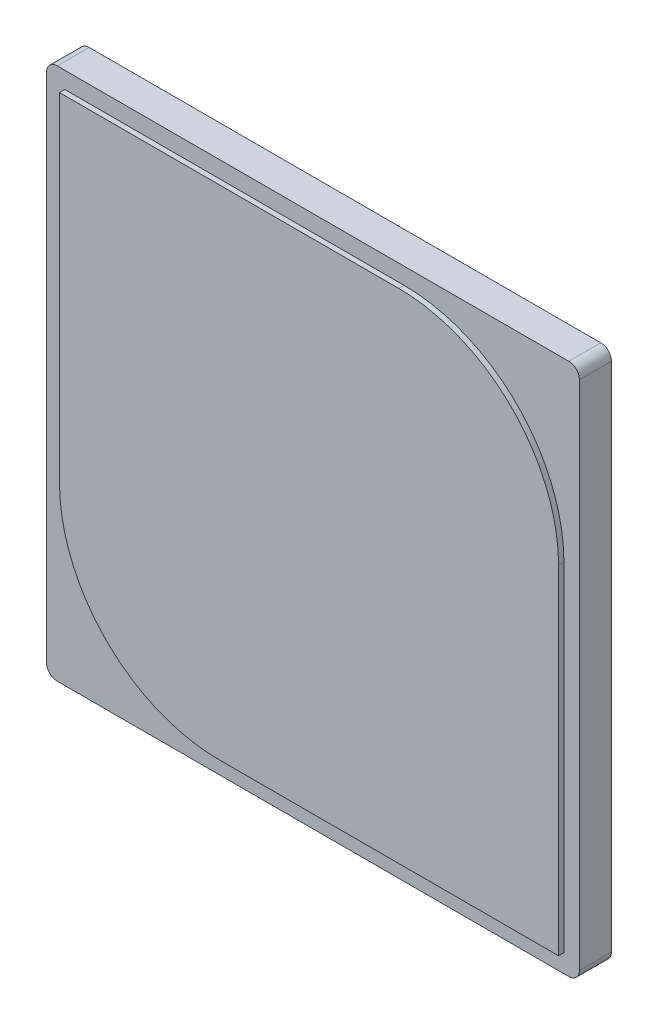
ISO-10303-21;
HEADER;
FILE_DESCRIPTION(('STEP AP214'),'2;1');
FILE_NAME('part.step','',(''),(''),'','','');
FILE_SCHEMA(('AUTOMOTIVE_DESIGN { 1 0 10303 214 1 1 1 1 }'));
ENDSEC;
DATA;
#1=APPLICATION_CONTEXT('core data for automotive mechanical design processes');
#2=APPLICATION_PROTOCOL_DEFINITION('international standard','automotive_design',2000,#1);
#3=PRODUCT_CONTEXT('',#1,'mechanical');
#4=PRODUCT('Part','Part','',(#3));
#5=PRODUCT_RELATED_PRODUCT_CATEGORY('part','',(#4));
#6=PRODUCT_DEFINITION_FORMATION('','',#4);
#7=PRODUCT_DEFINITION_CONTEXT('part definition',#1,'design');
#8=PRODUCT_DEFINITION('design','',#6,#7);
#9=PRODUCT_DEFINITION_SHAPE('','',#8);
#10=(LENGTH_UNIT() NAMED_UNIT(*) SI_UNIT(.MILLI.,.METRE.));
#11=(NAMED_UNIT(*) PLANE_ANGLE_UNIT() SI_UNIT($,.RADIAN.));
#12=(NAMED_UNIT(*) SI_UNIT($,.STERADIAN.) SOLID_ANGLE_UNIT());
#13=UNCERTAINTY_MEASURE_WITH_UNIT(LENGTH_MEASURE(1.E-05),#10,'distance_accuracy_value','');
#14=(GEOMETRIC_REPRESENTATION_CONTEXT(3) GLOBAL_UNCERTAINTY_ASSIGNED_CONTEXT((#13)) GLOBAL_UNIT_ASSIGNED_CONTEXT((#10,
#11,#12)) REPRESENTATION_CONTEXT('',''));
#15=CARTESIAN_POINT('',(0.,0.,0.));
#16=DIRECTION('',(0.,0.,1.));
#17=DIRECTION('',(1.,0.,0.));
#18=AXIS2_PLACEMENT_3D('',#15,#16,#17);
#19=CARTESIAN_POINT('',(-15.7317073170732,17.7317073170732,0.7));
#20=DIRECTION('',(1.,0.,0.));
#21=DIRECTION('',(0.,0.,-1.));
#22=AXIS2_PLACEMENT_3D('',#19,#20,#21);
#23=PLANE('',#22);
#24=DIRECTION('',(0.,-1.,0.));
#25=VECTOR('',#24,1.);
#26=CARTESIAN_POINT('',(-15.7317073170732,17.7317073170732,0.));
#27=LINE('',#26,#25);
#28=CARTESIAN_POINT('',(-15.7317073170732,17.5317073170732,0.));
#29=VERTEX_POINT('',#28);
#30=CARTESIAN_POINT('',(-15.7317073170732,7.93170731707317,0.));
#31=VERTEX_POINT('',#30);
#32=EDGE_CURVE('E208',#29,#31,#27,.T.);
#33=ORIENTED_EDGE('',*,*,#32,.T.);
#34=DIRECTION('',(0.,0.,-1.));
#35=VECTOR('',#34,1.);
#36=CARTESIAN_POINT('',(-15.7317073170732,7.93170731707317,0.7));
#37=LINE('',#36,#35);
#38=CARTESIAN_POINT('',(-15.7317073170732,7.93170731707317,0.6));
#39=VERTEX_POINT('',#38);
#40=EDGE_CURVE('E235',#31,#39,#37,.F.);
#41=ORIENTED_EDGE('',*,*,#40,.T.);
#42=DIRECTION('',(0.,-1.,0.));
#43=VECTOR('',#42,1.);
#44=CARTESIAN_POINT('',(-15.7317073170732,17.7317073170732,0.6));
#45=LINE('',#44,#43);
#46=CARTESIAN_POINT('',(-15.7317073170732,17.5317073170732,0.6));
#47=VERTEX_POINT('',#46);
#48=EDGE_CURVE('E191',#47,#39,#45,.T.);
#49=ORIENTED_EDGE('',*,*,#48,.F.);
#50=DIRECTION('',(0.,0.,-1.));
#51=VECTOR('',#50,1.);
#52=CARTESIAN_POINT('',(-15.7317073170732,17.5317073170732,0.7));
#53=LINE('',#52,#51);
#54=EDGE_CURVE('E232',#47,#29,#53,.T.);
#55=ORIENTED_EDGE('',*,*,#54,.T.);
#56=EDGE_LOOP('',(#33,#41,#49,#55));
#57=FACE_BOUND('',#56,.T.);
#58=ADVANCED_FACE('F36',(#57),#23,.F.);
#59=CARTESIAN_POINT('',(-15.7317073170732,7.73170731707317,0.7));
#60=DIRECTION('',(0.,1.,0.));
#61=DIRECTION('',(0.,0.,1.));
#62=AXIS2_PLACEMENT_3D('',#59,#60,#61);
#63=PLANE('',#62);
#64=DIRECTION('',(1.,0.,0.));
#65=VECTOR('',#64,1.);
#66=CARTESIAN_POINT('',(-15.7317073170732,7.73170731707317,0.6));
#67=LINE('',#66,#65);
#68=CARTESIAN_POINT('',(-15.5317073170732,7.73170731707317,0.6));
#69=VERTEX_POINT('',#68);
#70=CARTESIAN_POINT('',(-5.93170731707316,7.73170731707317,0.6));
#71=VERTEX_POINT('',#70);
#72=EDGE_CURVE('E201',#69,#71,#67,.T.);
#73=ORIENTED_EDGE('',*,*,#72,.F.);
#74=DIRECTION('',(0.,0.,-1.));
#75=VECTOR('',#74,1.);
#76=CARTESIAN_POINT('',(-15.5317073170732,7.73170731707317,0.7));
#77=LINE('',#76,#75);
#78=CARTESIAN_POINT('',(-15.5317073170732,7.73170731707317,0.));
#79=VERTEX_POINT('',#78);
#80=EDGE_CURVE('E221',#69,#79,#77,.T.);
#81=ORIENTED_EDGE('',*,*,#80,.T.);
#82=DIRECTION('',(1.,0.,0.));
#83=VECTOR('',#82,1.);
#84=CARTESIAN_POINT('',(-15.7317073170732,7.73170731707317,0.));
#85=LINE('',#84,#83);
#86=CARTESIAN_POINT('',(-5.93170731707316,7.73170731707317,0.));
#87=VERTEX_POINT('',#86);
#88=EDGE_CURVE('E211',#79,#87,#85,.T.);
#89=ORIENTED_EDGE('',*,*,#88,.T.);
#90=DIRECTION('',(0.,0.,-1.));
#91=VECTOR('',#90,1.);
#92=CARTESIAN_POINT('',(-5.93170731707316,7.73170731707317,0.7));
#93=LINE('',#92,#91);
#94=EDGE_CURVE('E219',#87,#71,#93,.F.);
#95=ORIENTED_EDGE('',*,*,#94,.T.);
#96=EDGE_LOOP('',(#73,#81,#89,#95));
#97=FACE_BOUND('',#96,.T.);
#98=ADVANCED_FACE('F277',(#97),#63,.F.);
#99=CARTESIAN_POINT('',(-5.73170731707317,17.7317073170732,0.7));
#100=DIRECTION('',(-1.,0.,0.));
#101=DIRECTION('',(0.,-1.,0.));
#102=AXIS2_PLACEMENT_3D('',#99,#100,#101);
#103=PLANE('',#102);
#104=DIRECTION('',(0.,1.,0.));
#105=VECTOR('',#104,1.);
#106=CARTESIAN_POINT('',(-5.73170731707317,17.7317073170732,0.6));
#107=LINE('',#106,#105);
#108=CARTESIAN_POINT('',(-5.73170731707317,7.93170731707317,0.6));
#109=VERTEX_POINT('',#108);
#110=CARTESIAN_POINT('',(-5.73170731707317,17.5317073170732,0.6));
#111=VERTEX_POINT('',#110);
#112=EDGE_CURVE('E204',#109,#111,#107,.T.);
#113=ORIENTED_EDGE('',*,*,#112,.F.);
#114=DIRECTION('',(0.,0.,-1.));
#115=VECTOR('',#114,1.);
#116=CARTESIAN_POINT('',(-5.73170731707317,7.93170731707317,0.7));
#117=LINE('',#116,#115);
#118=CARTESIAN_POINT('',(-5.73170731707317,7.93170731707317,0.));
#119=VERTEX_POINT('',#118);
#120=EDGE_CURVE('E246',#109,#119,#117,.T.);
#121=ORIENTED_EDGE('',*,*,#120,.T.);
#122=DIRECTION('',(0.,1.,0.));
#123=VECTOR('',#122,1.);
#124=CARTESIAN_POINT('',(-5.73170731707317,17.7317073170732,0.));
#125=LINE('',#124,#123);
#126=CARTESIAN_POINT('',(-5.73170731707317,17.5317073170732,0.));
#127=VERTEX_POINT('',#126);
#128=EDGE_CURVE('E214',#119,#127,#125,.T.);
#129=ORIENTED_EDGE('',*,*,#128,.T.);
#130=DIRECTION('',(0.,0.,-1.));
#131=VECTOR('',#130,1.);
#132=CARTESIAN_POINT('',(-5.73170731707317,17.5317073170732,0.7));
#133=LINE('',#132,#131);
#134=EDGE_CURVE('E244',#127,#111,#133,.F.);
#135=ORIENTED_EDGE('',*,*,#134,.T.);
#136=EDGE_LOOP('',(#113,#121,#129,#135));
#137=FACE_BOUND('',#136,.T.);
#138=ADVANCED_FACE('F252',(#137),#103,.F.);
#139=CARTESIAN_POINT('',(-15.7317073170732,17.7317073170732,0.7));
#140=DIRECTION('',(0.,-1.,0.));
#141=DIRECTION('',(0.,0.,-1.));
#142=AXIS2_PLACEMENT_3D('',#139,#140,#141);
#143=PLANE('',#142);
#144=DIRECTION('',(-1.,0.,0.));
#145=VECTOR('',#144,1.);
#146=CARTESIAN_POINT('',(-15.7317073170732,17.7317073170732,0.6));
#147=LINE('',#146,#145);
#148=CARTESIAN_POINT('',(-5.93170731707317,17.7317073170732,0.6));
#149=VERTEX_POINT('',#148);
#150=CARTESIAN_POINT('',(-15.5317073170732,17.7317073170732,0.6));
#151=VERTEX_POINT('',#150);
#152=EDGE_CURVE('E206',#149,#151,#147,.T.);
#153=ORIENTED_EDGE('',*,*,#152,.F.);
#154=DIRECTION('',(0.,0.,-1.));
#155=VECTOR('',#154,1.);
#156=CARTESIAN_POINT('',(-5.93170731707317,17.7317073170732,0.7));
#157=LINE('',#156,#155);
#158=CARTESIAN_POINT('',(-5.93170731707317,17.7317073170732,0.));
#159=VERTEX_POINT('',#158);
#160=EDGE_CURVE('E11',#149,#159,#157,.T.);
#161=ORIENTED_EDGE('',*,*,#160,.T.);
#162=DIRECTION('',(-1.,0.,0.));
#163=VECTOR('',#162,1.);
#164=CARTESIAN_POINT('',(-15.7317073170732,17.7317073170732,0.));
#165=LINE('',#164,#163);
#166=CARTESIAN_POINT('',(-15.5317073170732,17.7317073170732,0.));
#167=VERTEX_POINT('',#166);
#168=EDGE_CURVE('E217',#159,#167,#165,.T.);
#169=ORIENTED_EDGE('',*,*,#168,.T.);
#170=DIRECTION('',(0.,0.,-1.));
#171=VECTOR('',#170,1.);
#172=CARTESIAN_POINT('',(-15.5317073170732,17.7317073170732,0.7));
#173=LINE('',#172,#171);
#174=EDGE_CURVE('E44',#167,#151,#173,.F.);
#175=ORIENTED_EDGE('',*,*,#174,.T.);
#176=EDGE_LOOP('',(#153,#161,#169,#175));
#177=FACE_BOUND('',#176,.T.);
#178=ADVANCED_FACE('F263',(#177),#143,.F.);
#179=CARTESIAN_POINT('',(0.,0.,0.));
#180=DIRECTION('',(0.,0.,1.));
#181=DIRECTION('',(1.,0.,0.));
#182=AXIS2_PLACEMENT_3D('',#179,#180,#181);
#183=PLANE('',#182);
#184=ORIENTED_EDGE('',*,*,#88,.F.);
#185=CARTESIAN_POINT('',(-15.5317073170732,7.93170731707317,0.));
#186=DIRECTION('',(0.,0.,1.));
#187=DIRECTION('',(1.,0.,0.));
#188=AXIS2_PLACEMENT_3D('',#185,#186,#187);
#189=CIRCLE('',#188,0.2);
#190=EDGE_CURVE('E230',#79,#31,#189,.F.);
#191=ORIENTED_EDGE('',*,*,#190,.T.);
#192=ORIENTED_EDGE('',*,*,#32,.F.);
#193=CARTESIAN_POINT('',(-15.5317073170732,17.5317073170732,0.));
#194=DIRECTION('',(0.,0.,1.));
#195=DIRECTION('',(1.,0.,0.));
#196=AXIS2_PLACEMENT_3D('',#193,#194,#195);
#197=CIRCLE('',#196,0.2);
#198=EDGE_CURVE('E224',#29,#167,#197,.F.);
#199=ORIENTED_EDGE('',*,*,#198,.T.);
#200=ORIENTED_EDGE('',*,*,#168,.F.);
#201=CARTESIAN_POINT('',(-5.93170731707317,17.5317073170732,0.));
#202=DIRECTION('',(0.,0.,1.));
#203=DIRECTION('',(1.,0.,0.));
#204=AXIS2_PLACEMENT_3D('',#201,#202,#203);
#205=CIRCLE('',#204,0.2);
#206=EDGE_CURVE('E226',#159,#127,#205,.F.);
#207=ORIENTED_EDGE('',*,*,#206,.T.);
#208=ORIENTED_EDGE('',*,*,#128,.F.);
#209=CARTESIAN_POINT('',(-5.93170731707317,7.93170731707317,0.));
#210=DIRECTION('',(0.,0.,1.));
#211=DIRECTION('',(1.,0.,0.));
#212=AXIS2_PLACEMENT_3D('',#209,#210,#211);
#213=CIRCLE('',#212,0.2);
#214=EDGE_CURVE('E228',#119,#87,#213,.F.);
#215=ORIENTED_EDGE('',*,*,#214,.T.);
#216=EDGE_LOOP('',(#184,#191,#192,#199,#200,#207,#208,#215));
#217=FACE_BOUND('',#216,.T.);
#218=ADVANCED_FACE('F258',(#217),#183,.F.);
#219=CARTESIAN_POINT('',(0.,0.,0.6));
#220=DIRECTION('',(0.,0.,1.));
#221=DIRECTION('',(1.,0.,0.));
#222=AXIS2_PLACEMENT_3D('',#219,#220,#221);
#223=PLANE('',#222);
#224=DIRECTION('',(-1.,0.,0.));
#225=VECTOR('',#224,1.);
#226=CARTESIAN_POINT('',(-15.3895890164223,17.4198023031208,0.6));
#227=LINE('',#226,#225);
#228=CARTESIAN_POINT('',(-9.02347013989321,17.4198023031208,0.6));
#229=VERTEX_POINT('',#228);
#230=CARTESIAN_POINT('',(-15.3895890164223,17.4198023031208,0.6));
#231=VERTEX_POINT('',#230);
#232=EDGE_CURVE('E150',#229,#231,#227,.T.);
#233=ORIENTED_EDGE('',*,*,#232,.F.);
#234=CARTESIAN_POINT('',(-9.02347013989319,14.4198023031208,0.6));
#235=DIRECTION('',(0.,0.,1.));
#236=DIRECTION('',(1.,0.,0.));
#237=AXIS2_PLACEMENT_3D('',#234,#235,#236);
#238=CIRCLE('',#237,3.);
#239=CARTESIAN_POINT('',(-6.02347013989319,14.4198023031208,0.6));
#240=VERTEX_POINT('',#239);
#241=EDGE_CURVE('E175',#240,#229,#238,.T.);
#242=ORIENTED_EDGE('',*,*,#241,.F.);
#243=DIRECTION('',(0.,1.,0.));
#244=VECTOR('',#243,1.);
#245=CARTESIAN_POINT('',(-6.02347013989319,14.4198023031208,0.6));
#246=LINE('',#245,#244);
#247=CARTESIAN_POINT('',(-6.02347013989319,8.07382561772399,0.6));
#248=VERTEX_POINT('',#247);
#249=EDGE_CURVE('E172',#248,#240,#246,.T.);
#250=ORIENTED_EDGE('',*,*,#249,.F.);
#251=DIRECTION('',(1.,0.,0.));
#252=VECTOR('',#251,1.);
#253=CARTESIAN_POINT('',(-12.3895890164223,8.07382561772399,0.6));
#254=LINE('',#253,#252);
#255=CARTESIAN_POINT('',(-12.3895890164223,8.07382561772399,0.6));
#256=VERTEX_POINT('',#255);
#257=EDGE_CURVE('E160',#256,#248,#254,.T.);
#258=ORIENTED_EDGE('',*,*,#257,.F.);
#259=CARTESIAN_POINT('',(-12.3895890164223,11.073825617724,0.6));
#260=DIRECTION('',(0.,0.,1.));
#261=DIRECTION('',(-1.,0.,0.));
#262=AXIS2_PLACEMENT_3D('',#259,#260,#261);
#263=CIRCLE('',#262,3.);
#264=CARTESIAN_POINT('',(-15.3895890164223,11.073825617724,0.6));
#265=VERTEX_POINT('',#264);
#266=EDGE_CURVE('E142',#265,#256,#263,.T.);
#267=ORIENTED_EDGE('',*,*,#266,.F.);
#268=DIRECTION('',(0.,-1.,0.));
#269=VECTOR('',#268,1.);
#270=CARTESIAN_POINT('',(-15.3895890164223,17.4198023031208,0.6));
#271=LINE('',#270,#269);
#272=EDGE_CURVE('E156',#231,#265,#271,.T.);
#273=ORIENTED_EDGE('',*,*,#272,.F.);
#274=EDGE_LOOP('',(#233,#242,#250,#258,#267,#273));
#275=FACE_BOUND('',#274,.T.);
#276=ORIENTED_EDGE('',*,*,#48,.T.);
#277=CARTESIAN_POINT('',(-15.5317073170732,7.93170731707317,0.6));
#278=DIRECTION('',(0.,0.,1.));
#279=DIRECTION('',(1.,0.,0.));
#280=AXIS2_PLACEMENT_3D('',#277,#278,#279);
#281=CIRCLE('',#280,0.2);
#282=EDGE_CURVE('E242',#39,#69,#281,.T.);
#283=ORIENTED_EDGE('',*,*,#282,.T.);
#284=ORIENTED_EDGE('',*,*,#72,.T.);
#285=CARTESIAN_POINT('',(-5.93170731707317,7.93170731707317,0.6));
#286=DIRECTION('',(0.,0.,1.));
#287=DIRECTION('',(1.,0.,0.));
#288=AXIS2_PLACEMENT_3D('',#285,#286,#287);
#289=CIRCLE('',#288,0.2);
#290=EDGE_CURVE('E240',#71,#109,#289,.T.);
#291=ORIENTED_EDGE('',*,*,#290,.T.);
#292=ORIENTED_EDGE('',*,*,#112,.T.);
#293=CARTESIAN_POINT('',(-5.93170731707317,17.5317073170732,0.6));
#294=DIRECTION('',(0.,0.,1.));
#295=DIRECTION('',(1.,0.,0.));
#296=AXIS2_PLACEMENT_3D('',#293,#294,#295);
#297=CIRCLE('',#296,0.2);
#298=EDGE_CURVE('E57',#111,#149,#297,.T.);
#299=ORIENTED_EDGE('',*,*,#298,.T.);
#300=ORIENTED_EDGE('',*,*,#152,.T.);
#301=CARTESIAN_POINT('',(-15.5317073170732,17.5317073170732,0.6));
#302=DIRECTION('',(0.,0.,1.));
#303=DIRECTION('',(1.,0.,0.));
#304=AXIS2_PLACEMENT_3D('',#301,#302,#303);
#305=CIRCLE('',#304,0.2);
#306=EDGE_CURVE('E237',#151,#47,#305,.T.);
#307=ORIENTED_EDGE('',*,*,#306,.T.);
#308=EDGE_LOOP('',(#276,#283,#284,#291,#292,#299,#300,#307));
#309=FACE_BOUND('',#308,.T.);
#310=ADVANCED_FACE('F155',(#275,#309),#223,.T.);
#311=CARTESIAN_POINT('',(-15.3895890164223,17.4198023031208,0.6));
#312=DIRECTION('',(-1.,0.,0.));
#313=DIRECTION('',(0.,0.,1.));
#314=AXIS2_PLACEMENT_3D('',#311,#312,#313);
#315=PLANE('',#314);
#316=DIRECTION('',(0.,-1.,0.));
#317=VECTOR('',#316,1.);
#318=CARTESIAN_POINT('',(-15.3895890164223,17.4198023031208,0.7));
#319=LINE('',#318,#317);
#320=CARTESIAN_POINT('',(-15.3895890164223,17.4198023031208,0.7));
#321=VERTEX_POINT('',#320);
#322=CARTESIAN_POINT('',(-15.3895890164223,11.073825617724,0.7));
#323=VERTEX_POINT('',#322);
#324=EDGE_CURVE('E179',#321,#323,#319,.T.);
#325=ORIENTED_EDGE('',*,*,#324,.F.);
#326=DIRECTION('',(0.,0.,1.));
#327=VECTOR('',#326,1.);
#328=CARTESIAN_POINT('',(-15.3895890164223,17.4198023031208,0.6));
#329=LINE('',#328,#327);
#330=EDGE_CURVE('E164',#231,#321,#329,.T.);
#331=ORIENTED_EDGE('',*,*,#330,.F.);
#332=ORIENTED_EDGE('',*,*,#272,.T.);
#333=DIRECTION('',(0.,0.,1.));
#334=VECTOR('',#333,1.);
#335=CARTESIAN_POINT('',(-15.3895890164223,11.073825617724,0.6));
#336=LINE('',#335,#334);
#337=EDGE_CURVE('E138',#265,#323,#336,.T.);
#338=ORIENTED_EDGE('',*,*,#337,.T.);
#339=EDGE_LOOP('',(#325,#331,#332,#338));
#340=FACE_BOUND('',#339,.T.);
#341=ADVANCED_FACE('F163',(#340),#315,.T.);
#342=CARTESIAN_POINT('',(-15.3895890164223,17.4198023031208,0.6));
#343=DIRECTION('',(0.,1.,0.));
#344=DIRECTION('',(0.,0.,1.));
#345=AXIS2_PLACEMENT_3D('',#342,#343,#344);
#346=PLANE('',#345);
#347=DIRECTION('',(-1.,0.,0.));
#348=VECTOR('',#347,1.);
#349=CARTESIAN_POINT('',(-15.3895890164223,17.4198023031208,0.7));
#350=LINE('',#349,#348);
#351=CARTESIAN_POINT('',(-9.02347013989321,17.4198023031208,0.7));
#352=VERTEX_POINT('',#351);
#353=EDGE_CURVE('E165',#352,#321,#350,.T.);
#354=ORIENTED_EDGE('',*,*,#353,.F.);
#355=DIRECTION('',(0.,0.,1.));
#356=VECTOR('',#355,1.);
#357=CARTESIAN_POINT('',(-9.02347013989321,17.4198023031208,0.6));
#358=LINE('',#357,#356);
#359=EDGE_CURVE('E192',#229,#352,#358,.T.);
#360=ORIENTED_EDGE('',*,*,#359,.F.);
#361=ORIENTED_EDGE('',*,*,#232,.T.);
#362=ORIENTED_EDGE('',*,*,#330,.T.);
#363=EDGE_LOOP('',(#354,#360,#361,#362));
#364=FACE_BOUND('',#363,.T.);
#365=ADVANCED_FACE('F308',(#364),#346,.T.);
#366=CARTESIAN_POINT('',(-9.02347013989319,14.4198023031208,0.6));
#367=DIRECTION('',(0.,0.,1.));
#368=DIRECTION('',(1.,0.,0.));
#369=AXIS2_PLACEMENT_3D('',#366,#367,#368);
#370=CYLINDRICAL_SURFACE('',#369,3.);
#371=CARTESIAN_POINT('',(-9.02347013989319,14.4198023031208,0.7));
#372=DIRECTION('',(0.,0.,1.));
#373=DIRECTION('',(1.,0.,0.));
#374=AXIS2_PLACEMENT_3D('',#371,#372,#373);
#375=CIRCLE('',#374,3.);
#376=CARTESIAN_POINT('',(-6.02347013989319,14.4198023031208,0.7));
#377=VERTEX_POINT('',#376);
#378=EDGE_CURVE('E168',#377,#352,#375,.T.);
#379=ORIENTED_EDGE('',*,*,#378,.F.);
#380=DIRECTION('',(0.,0.,1.));
#381=VECTOR('',#380,1.);
#382=CARTESIAN_POINT('',(-6.02347013989319,14.4198023031208,0.6));
#383=LINE('',#382,#381);
#384=EDGE_CURVE('E194',#240,#377,#383,.T.);
#385=ORIENTED_EDGE('',*,*,#384,.F.);
#386=ORIENTED_EDGE('',*,*,#241,.T.);
#387=ORIENTED_EDGE('',*,*,#359,.T.);
#388=EDGE_LOOP('',(#379,#385,#386,#387));
#389=FACE_BOUND('',#388,.T.);
#390=ADVANCED_FACE('F318',(#389),#370,.T.);
#391=CARTESIAN_POINT('',(-6.02347013989319,14.4198023031208,0.6));
#392=DIRECTION('',(1.,0.,0.));
#393=DIRECTION('',(0.,0.,-1.));
#394=AXIS2_PLACEMENT_3D('',#391,#392,#393);
#395=PLANE('',#394);
#396=DIRECTION('',(0.,1.,0.));
#397=VECTOR('',#396,1.);
#398=CARTESIAN_POINT('',(-6.02347013989319,14.4198023031208,0.7));
#399=LINE('',#398,#397);
#400=CARTESIAN_POINT('',(-6.02347013989319,8.07382561772399,0.7));
#401=VERTEX_POINT('',#400);
#402=EDGE_CURVE('E185',#401,#377,#399,.T.);
#403=ORIENTED_EDGE('',*,*,#402,.F.);
#404=DIRECTION('',(0.,0.,1.));
#405=VECTOR('',#404,1.);
#406=CARTESIAN_POINT('',(-6.02347013989319,8.07382561772399,0.6));
#407=LINE('',#406,#405);
#408=EDGE_CURVE('E196',#248,#401,#407,.T.);
#409=ORIENTED_EDGE('',*,*,#408,.F.);
#410=ORIENTED_EDGE('',*,*,#249,.T.);
#411=ORIENTED_EDGE('',*,*,#384,.T.);
#412=EDGE_LOOP('',(#403,#409,#410,#411));
#413=FACE_BOUND('',#412,.T.);
#414=ADVANCED_FACE('F314',(#413),#395,.T.);
#415=CARTESIAN_POINT('',(-12.3895890164223,8.07382561772399,0.6));
#416=DIRECTION('',(0.,-1.,0.));
#417=DIRECTION('',(0.,0.,-1.));
#418=AXIS2_PLACEMENT_3D('',#415,#416,#417);
#419=PLANE('',#418);
#420=DIRECTION('',(1.,0.,0.));
#421=VECTOR('',#420,1.);
#422=CARTESIAN_POINT('',(-12.3895890164223,8.07382561772399,0.7));
#423=LINE('',#422,#421);
#424=CARTESIAN_POINT('',(-12.3895890164223,8.07382561772399,0.7));
#425=VERTEX_POINT('',#424);
#426=EDGE_CURVE('E182',#425,#401,#423,.T.);
#427=ORIENTED_EDGE('',*,*,#426,.F.);
#428=DIRECTION('',(0.,0.,1.));
#429=VECTOR('',#428,1.);
#430=CARTESIAN_POINT('',(-12.3895890164223,8.07382561772399,0.6));
#431=LINE('',#430,#429);
#432=EDGE_CURVE('E149',#256,#425,#431,.T.);
#433=ORIENTED_EDGE('',*,*,#432,.F.);
#434=ORIENTED_EDGE('',*,*,#257,.T.);
#435=ORIENTED_EDGE('',*,*,#408,.T.);
#436=EDGE_LOOP('',(#427,#433,#434,#435));
#437=FACE_BOUND('',#436,.T.);
#438=ADVANCED_FACE('F311',(#437),#419,.T.);
#439=CARTESIAN_POINT('',(-12.3895890164223,11.073825617724,0.6));
#440=DIRECTION('',(0.,0.,1.));
#441=DIRECTION('',(1.,0.,0.));
#442=AXIS2_PLACEMENT_3D('',#439,#440,#441);
#443=CYLINDRICAL_SURFACE('',#442,3.);
#444=CARTESIAN_POINT('',(-12.3895890164223,11.073825617724,0.7));
#445=DIRECTION('',(0.,0.,1.));
#446=DIRECTION('',(-1.,0.,0.));
#447=AXIS2_PLACEMENT_3D('',#444,#445,#446);
#448=CIRCLE('',#447,3.);
#449=EDGE_CURVE('E144',#323,#425,#448,.T.);
#450=ORIENTED_EDGE('',*,*,#449,.F.);
#451=ORIENTED_EDGE('',*,*,#337,.F.);
#452=ORIENTED_EDGE('',*,*,#266,.T.);
#453=ORIENTED_EDGE('',*,*,#432,.T.);
#454=EDGE_LOOP('',(#450,#451,#452,#453));
#455=FACE_BOUND('',#454,.T.);
#456=ADVANCED_FACE('F140',(#455),#443,.T.);
#457=CARTESIAN_POINT('',(0.,0.,0.7));
#458=DIRECTION('',(0.,0.,1.));
#459=DIRECTION('',(1.,0.,0.));
#460=AXIS2_PLACEMENT_3D('',#457,#458,#459);
#461=PLANE('',#460);
#462=ORIENTED_EDGE('',*,*,#353,.T.);
#463=ORIENTED_EDGE('',*,*,#324,.T.);
#464=ORIENTED_EDGE('',*,*,#449,.T.);
#465=ORIENTED_EDGE('',*,*,#426,.T.);
#466=ORIENTED_EDGE('',*,*,#402,.T.);
#467=ORIENTED_EDGE('',*,*,#378,.T.);
#468=EDGE_LOOP('',(#462,#463,#464,#465,#466,#467));
#469=FACE_BOUND('',#468,.T.);
#470=ADVANCED_FACE('F286',(#469),#461,.T.);
#471=CARTESIAN_POINT('',(-15.5317073170732,7.93170731707317,0.7));
#472=DIRECTION('',(0.,0.,-1.));
#473=DIRECTION('',(-1.,0.,0.));
#474=AXIS2_PLACEMENT_3D('',#471,#472,#473);
#475=CYLINDRICAL_SURFACE('',#474,0.2);
#476=ORIENTED_EDGE('',*,*,#282,.F.);
#477=ORIENTED_EDGE('',*,*,#40,.F.);
#478=ORIENTED_EDGE('',*,*,#190,.F.);
#479=ORIENTED_EDGE('',*,*,#80,.F.);
#480=EDGE_LOOP('',(#476,#477,#478,#479));
#481=FACE_BOUND('',#480,.T.);
#482=ADVANCED_FACE('F274',(#481),#475,.T.);
#483=CARTESIAN_POINT('',(-5.93170731707317,7.93170731707317,0.7));
#484=DIRECTION('',(0.,0.,-1.));
#485=DIRECTION('',(-1.,0.,0.));
#486=AXIS2_PLACEMENT_3D('',#483,#484,#485);
#487=CYLINDRICAL_SURFACE('',#486,0.2);
#488=ORIENTED_EDGE('',*,*,#290,.F.);
#489=ORIENTED_EDGE('',*,*,#94,.F.);
#490=ORIENTED_EDGE('',*,*,#214,.F.);
#491=ORIENTED_EDGE('',*,*,#120,.F.);
#492=EDGE_LOOP('',(#488,#489,#490,#491));
#493=FACE_BOUND('',#492,.T.);
#494=ADVANCED_FACE('F279',(#493),#487,.T.);
#495=CARTESIAN_POINT('',(-5.93170731707317,17.5317073170732,0.7));
#496=DIRECTION('',(0.,0.,-1.));
#497=DIRECTION('',(-1.,0.,0.));
#498=AXIS2_PLACEMENT_3D('',#495,#496,#497);
#499=CYLINDRICAL_SURFACE('',#498,0.2);
#500=ORIENTED_EDGE('',*,*,#298,.F.);
#501=ORIENTED_EDGE('',*,*,#134,.F.);
#502=ORIENTED_EDGE('',*,*,#206,.F.);
#503=ORIENTED_EDGE('',*,*,#160,.F.);
#504=EDGE_LOOP('',(#500,#501,#502,#503));
#505=FACE_BOUND('',#504,.T.);
#506=ADVANCED_FACE('F262',(#505),#499,.T.);
#507=CARTESIAN_POINT('',(-15.5317073170732,17.5317073170732,0.7));
#508=DIRECTION('',(0.,0.,-1.));
#509=DIRECTION('',(-1.,0.,0.));
#510=AXIS2_PLACEMENT_3D('',#507,#508,#509);
#511=CYLINDRICAL_SURFACE('',#510,0.2);
#512=ORIENTED_EDGE('',*,*,#306,.F.);
#513=ORIENTED_EDGE('',*,*,#174,.F.);
#514=ORIENTED_EDGE('',*,*,#198,.F.);
#515=ORIENTED_EDGE('',*,*,#54,.F.);
#516=EDGE_LOOP('',(#512,#513,#514,#515));
#517=FACE_BOUND('',#516,.T.);
#518=ADVANCED_FACE('F38',(#517),#511,.T.);
#519=CLOSED_SHELL('',(#58,#98,#138,#178,#218,#310,#341,#365,#390,#414,#438,#456,#470,#482,#494,
#506,#518));
#520=MANIFOLD_SOLID_BREP('B2',#519);
#521=ADVANCED_BREP_SHAPE_REPRESENTATION('',(#18,#520),#14);
#522=SHAPE_DEFINITION_REPRESENTATION(#9,#521);
ENDSEC;
END-ISO-10303-21;
